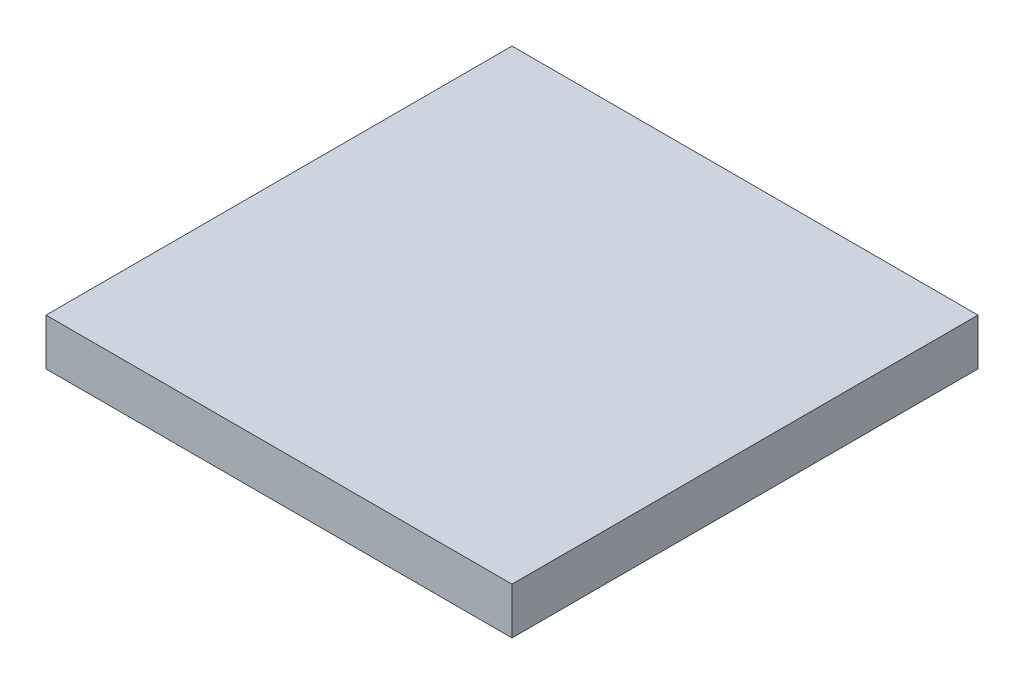
ISO-10303-21;
HEADER;
FILE_DESCRIPTION(('STEP AP214'),'2;1');
FILE_NAME('part.step','',(''),(''),'','','');
FILE_SCHEMA(('AUTOMOTIVE_DESIGN { 1 0 10303 214 1 1 1 1 }'));
ENDSEC;
DATA;
#1=APPLICATION_CONTEXT('core data for automotive mechanical design processes');
#2=APPLICATION_PROTOCOL_DEFINITION('international standard','automotive_design',2000,#1);
#3=PRODUCT_CONTEXT('',#1,'mechanical');
#4=PRODUCT('Part','Part','',(#3));
#5=PRODUCT_RELATED_PRODUCT_CATEGORY('part','',(#4));
#6=PRODUCT_DEFINITION_FORMATION('','',#4);
#7=PRODUCT_DEFINITION_CONTEXT('part definition',#1,'design');
#8=PRODUCT_DEFINITION('design','',#6,#7);
#9=PRODUCT_DEFINITION_SHAPE('','',#8);
#10=(LENGTH_UNIT() NAMED_UNIT(*) SI_UNIT(.MILLI.,.METRE.));
#11=(NAMED_UNIT(*) PLANE_ANGLE_UNIT() SI_UNIT($,.RADIAN.));
#12=(NAMED_UNIT(*) SI_UNIT($,.STERADIAN.) SOLID_ANGLE_UNIT());
#13=UNCERTAINTY_MEASURE_WITH_UNIT(LENGTH_MEASURE(1.E-05),#10,'distance_accuracy_value','');
#14=(GEOMETRIC_REPRESENTATION_CONTEXT(3) GLOBAL_UNCERTAINTY_ASSIGNED_CONTEXT((#13)) GLOBAL_UNIT_ASSIGNED_CONTEXT((#10,
#11,#12)) REPRESENTATION_CONTEXT('',''));
#15=CARTESIAN_POINT('',(0.,0.,0.));
#16=DIRECTION('',(0.,0.,1.));
#17=DIRECTION('',(1.,0.,0.));
#18=AXIS2_PLACEMENT_3D('',#15,#16,#17);
#19=CARTESIAN_POINT('',(250.,50.,-250.));
#20=DIRECTION('',(-1.,0.,0.));
#21=DIRECTION('',(0.,0.,1.));
#22=AXIS2_PLACEMENT_3D('',#19,#20,#21);
#23=PLANE('',#22);
#24=DIRECTION('',(0.,0.,-1.));
#25=VECTOR('',#24,1.);
#26=CARTESIAN_POINT('',(250.,0.,-250.));
#27=LINE('',#26,#25);
#28=CARTESIAN_POINT('',(250.,0.,250.));
#29=VERTEX_POINT('',#28);
#30=CARTESIAN_POINT('',(250.,0.,-250.));
#31=VERTEX_POINT('',#30);
#32=EDGE_CURVE('E107',#29,#31,#27,.T.);
#33=ORIENTED_EDGE('',*,*,#32,.T.);
#34=DIRECTION('',(0.,-1.,0.));
#35=VECTOR('',#34,1.);
#36=CARTESIAN_POINT('',(250.,50.,-250.));
#37=LINE('',#36,#35);
#38=CARTESIAN_POINT('',(250.,50.,-250.));
#39=VERTEX_POINT('',#38);
#40=EDGE_CURVE('E11',#39,#31,#37,.T.);
#41=ORIENTED_EDGE('',*,*,#40,.F.);
#42=DIRECTION('',(0.,0.,-1.));
#43=VECTOR('',#42,1.);
#44=CARTESIAN_POINT('',(250.,50.,-250.));
#45=LINE('',#44,#43);
#46=CARTESIAN_POINT('',(250.,50.,250.));
#47=VERTEX_POINT('',#46);
#48=EDGE_CURVE('E91',#47,#39,#45,.T.);
#49=ORIENTED_EDGE('',*,*,#48,.F.);
#50=DIRECTION('',(0.,-1.,0.));
#51=VECTOR('',#50,1.);
#52=CARTESIAN_POINT('',(250.,50.,250.));
#53=LINE('',#52,#51);
#54=EDGE_CURVE('E103',#47,#29,#53,.T.);
#55=ORIENTED_EDGE('',*,*,#54,.T.);
#56=EDGE_LOOP('',(#33,#41,#49,#55));
#57=FACE_BOUND('',#56,.T.);
#58=ADVANCED_FACE('F39',(#57),#23,.F.);
#59=CARTESIAN_POINT('',(-250.,50.,-250.));
#60=DIRECTION('',(0.,0.,1.));
#61=DIRECTION('',(1.,0.,0.));
#62=AXIS2_PLACEMENT_3D('',#59,#60,#61);
#63=PLANE('',#62);
#64=DIRECTION('',(-1.,0.,0.));
#65=VECTOR('',#64,1.);
#66=CARTESIAN_POINT('',(-250.,0.,-250.));
#67=LINE('',#66,#65);
#68=CARTESIAN_POINT('',(-250.,0.,-250.));
#69=VERTEX_POINT('',#68);
#70=EDGE_CURVE('E96',#31,#69,#67,.T.);
#71=ORIENTED_EDGE('',*,*,#70,.T.);
#72=DIRECTION('',(0.,-1.,0.));
#73=VECTOR('',#72,1.);
#74=CARTESIAN_POINT('',(-250.,50.,-250.));
#75=LINE('',#74,#73);
#76=CARTESIAN_POINT('',(-250.,50.,-250.));
#77=VERTEX_POINT('',#76);
#78=EDGE_CURVE('E48',#77,#69,#75,.T.);
#79=ORIENTED_EDGE('',*,*,#78,.F.);
#80=DIRECTION('',(-1.,0.,0.));
#81=VECTOR('',#80,1.);
#82=CARTESIAN_POINT('',(-250.,50.,-250.));
#83=LINE('',#82,#81);
#84=EDGE_CURVE('E86',#39,#77,#83,.T.);
#85=ORIENTED_EDGE('',*,*,#84,.F.);
#86=ORIENTED_EDGE('',*,*,#40,.T.);
#87=EDGE_LOOP('',(#71,#79,#85,#86));
#88=FACE_BOUND('',#87,.T.);
#89=ADVANCED_FACE('F95',(#88),#63,.F.);
#90=CARTESIAN_POINT('',(-250.,50.,-250.));
#91=DIRECTION('',(1.,0.,0.));
#92=DIRECTION('',(0.,0.,-1.));
#93=AXIS2_PLACEMENT_3D('',#90,#91,#92);
#94=PLANE('',#93);
#95=DIRECTION('',(0.,0.,1.));
#96=VECTOR('',#95,1.);
#97=CARTESIAN_POINT('',(-250.,0.,-250.));
#98=LINE('',#97,#96);
#99=CARTESIAN_POINT('',(-250.,0.,250.));
#100=VERTEX_POINT('',#99);
#101=EDGE_CURVE('E73',#69,#100,#98,.T.);
#102=ORIENTED_EDGE('',*,*,#101,.T.);
#103=DIRECTION('',(0.,-1.,0.));
#104=VECTOR('',#103,1.);
#105=CARTESIAN_POINT('',(-250.,50.,250.));
#106=LINE('',#105,#104);
#107=CARTESIAN_POINT('',(-250.,50.,250.));
#108=VERTEX_POINT('',#107);
#109=EDGE_CURVE('E98',#108,#100,#106,.T.);
#110=ORIENTED_EDGE('',*,*,#109,.F.);
#111=DIRECTION('',(0.,0.,1.));
#112=VECTOR('',#111,1.);
#113=CARTESIAN_POINT('',(-250.,50.,-250.));
#114=LINE('',#113,#112);
#115=EDGE_CURVE('E89',#77,#108,#114,.T.);
#116=ORIENTED_EDGE('',*,*,#115,.F.);
#117=ORIENTED_EDGE('',*,*,#78,.T.);
#118=EDGE_LOOP('',(#102,#110,#116,#117));
#119=FACE_BOUND('',#118,.T.);
#120=ADVANCED_FACE('F99',(#119),#94,.F.);
#121=CARTESIAN_POINT('',(-250.,50.,250.));
#122=DIRECTION('',(0.,0.,-1.));
#123=DIRECTION('',(-1.,0.,0.));
#124=AXIS2_PLACEMENT_3D('',#121,#122,#123);
#125=PLANE('',#124);
#126=DIRECTION('',(1.,0.,0.));
#127=VECTOR('',#126,1.);
#128=CARTESIAN_POINT('',(-250.,0.,250.));
#129=LINE('',#128,#127);
#130=EDGE_CURVE('E79',#100,#29,#129,.T.);
#131=ORIENTED_EDGE('',*,*,#130,.T.);
#132=ORIENTED_EDGE('',*,*,#54,.F.);
#133=DIRECTION('',(1.,0.,0.));
#134=VECTOR('',#133,1.);
#135=CARTESIAN_POINT('',(-250.,50.,250.));
#136=LINE('',#135,#134);
#137=EDGE_CURVE('E56',#108,#47,#136,.T.);
#138=ORIENTED_EDGE('',*,*,#137,.F.);
#139=ORIENTED_EDGE('',*,*,#109,.T.);
#140=EDGE_LOOP('',(#131,#132,#138,#139));
#141=FACE_BOUND('',#140,.T.);
#142=ADVANCED_FACE('F120',(#141),#125,.F.);
#143=CARTESIAN_POINT('',(0.,50.,0.));
#144=DIRECTION('',(0.,1.,0.));
#145=DIRECTION('',(0.,0.,1.));
#146=AXIS2_PLACEMENT_3D('',#143,#144,#145);
#147=PLANE('',#146);
#148=ORIENTED_EDGE('',*,*,#48,.T.);
#149=ORIENTED_EDGE('',*,*,#84,.T.);
#150=ORIENTED_EDGE('',*,*,#115,.T.);
#151=ORIENTED_EDGE('',*,*,#137,.T.);
#152=EDGE_LOOP('',(#148,#149,#150,#151));
#153=FACE_BOUND('',#152,.T.);
#154=ADVANCED_FACE('F87',(#153),#147,.T.);
#155=CARTESIAN_POINT('',(0.,0.,0.));
#156=DIRECTION('',(0.,1.,0.));
#157=DIRECTION('',(0.,0.,1.));
#158=AXIS2_PLACEMENT_3D('',#155,#156,#157);
#159=PLANE('',#158);
#160=ORIENTED_EDGE('',*,*,#32,.F.);
#161=ORIENTED_EDGE('',*,*,#130,.F.);
#162=ORIENTED_EDGE('',*,*,#101,.F.);
#163=ORIENTED_EDGE('',*,*,#70,.F.);
#164=EDGE_LOOP('',(#160,#161,#162,#163));
#165=FACE_BOUND('',#164,.T.);
#166=ADVANCED_FACE('F123',(#165),#159,.F.);
#167=CLOSED_SHELL('',(#58,#89,#120,#142,#154,#166));
#168=MANIFOLD_SOLID_BREP('B2',#167);
#169=ADVANCED_BREP_SHAPE_REPRESENTATION('',(#18,#168),#14);
#170=SHAPE_DEFINITION_REPRESENTATION(#9,#169);
ENDSEC;
END-ISO-10303-21;
